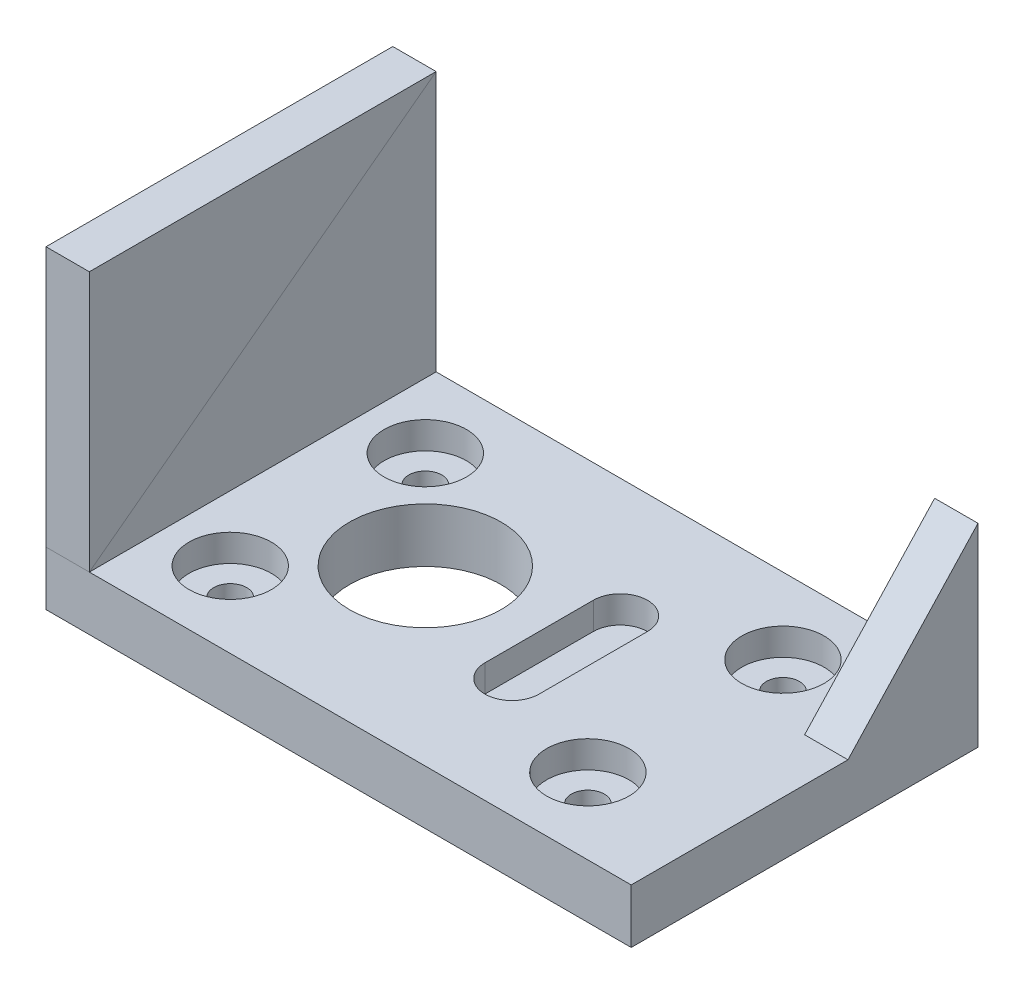
ISO-10303-21;
HEADER;
FILE_DESCRIPTION(('STEP AP214'),'2;1');
FILE_NAME('part.step','',(''),(''),'','','');
FILE_SCHEMA(('AUTOMOTIVE_DESIGN { 1 0 10303 214 1 1 1 1 }'));
ENDSEC;
DATA;
#1=APPLICATION_CONTEXT('core data for automotive mechanical design processes');
#2=APPLICATION_PROTOCOL_DEFINITION('international standard','automotive_design',2000,#1);
#3=PRODUCT_CONTEXT('',#1,'mechanical');
#4=PRODUCT('Part','Part','',(#3));
#5=PRODUCT_RELATED_PRODUCT_CATEGORY('part','',(#4));
#6=PRODUCT_DEFINITION_FORMATION('','',#4);
#7=PRODUCT_DEFINITION_CONTEXT('part definition',#1,'design');
#8=PRODUCT_DEFINITION('design','',#6,#7);
#9=PRODUCT_DEFINITION_SHAPE('','',#8);
#10=(LENGTH_UNIT() NAMED_UNIT(*) SI_UNIT(.MILLI.,.METRE.));
#11=(NAMED_UNIT(*) PLANE_ANGLE_UNIT() SI_UNIT($,.RADIAN.));
#12=(NAMED_UNIT(*) SI_UNIT($,.STERADIAN.) SOLID_ANGLE_UNIT());
#13=UNCERTAINTY_MEASURE_WITH_UNIT(LENGTH_MEASURE(1.E-05),#10,'distance_accuracy_value','');
#14=(GEOMETRIC_REPRESENTATION_CONTEXT(3) GLOBAL_UNCERTAINTY_ASSIGNED_CONTEXT((#13)) GLOBAL_UNIT_ASSIGNED_CONTEXT((#10,
#11,#12)) REPRESENTATION_CONTEXT('',''));
#15=CARTESIAN_POINT('',(0.,0.,0.));
#16=DIRECTION('',(0.,0.,1.));
#17=DIRECTION('',(1.,0.,0.));
#18=AXIS2_PLACEMENT_3D('',#15,#16,#17);
#19=CARTESIAN_POINT('',(-23.,29.,-16.));
#20=DIRECTION('',(0.,-1.,0.));
#21=DIRECTION('',(0.,0.,-1.));
#22=AXIS2_PLACEMENT_3D('',#19,#20,#21);
#23=PLANE('',#22);
#24=DIRECTION('',(0.,0.,1.));
#25=VECTOR('',#24,1.);
#26=CARTESIAN_POINT('',(-27.,29.,-16.));
#27=LINE('',#26,#25);
#28=CARTESIAN_POINT('',(-27.,29.,-16.));
#29=VERTEX_POINT('',#28);
#30=CARTESIAN_POINT('',(-27.,29.,16.));
#31=VERTEX_POINT('',#30);
#32=EDGE_CURVE('E96',#29,#31,#27,.T.);
#33=ORIENTED_EDGE('',*,*,#32,.T.);
#34=DIRECTION('',(-1.,0.,0.));
#35=VECTOR('',#34,1.);
#36=CARTESIAN_POINT('',(-23.,29.,16.));
#37=LINE('',#36,#35);
#38=CARTESIAN_POINT('',(-23.,29.,16.));
#39=VERTEX_POINT('',#38);
#40=EDGE_CURVE('E12',#39,#31,#37,.T.);
#41=ORIENTED_EDGE('',*,*,#40,.F.);
#42=DIRECTION('',(0.,0.,1.));
#43=VECTOR('',#42,1.);
#44=CARTESIAN_POINT('',(-23.,29.,-16.));
#45=LINE('',#44,#43);
#46=CARTESIAN_POINT('',(-23.,29.,-16.));
#47=VERTEX_POINT('',#46);
#48=EDGE_CURVE('E89',#47,#39,#45,.T.);
#49=ORIENTED_EDGE('',*,*,#48,.F.);
#50=DIRECTION('',(-1.,0.,0.));
#51=VECTOR('',#50,1.);
#52=CARTESIAN_POINT('',(-23.,29.,-16.));
#53=LINE('',#52,#51);
#54=EDGE_CURVE('E97',#47,#29,#53,.T.);
#55=ORIENTED_EDGE('',*,*,#54,.T.);
#56=EDGE_LOOP('',(#33,#41,#49,#55));
#57=FACE_BOUND('',#56,.T.);
#58=ADVANCED_FACE('F49',(#57),#23,.F.);
#59=CARTESIAN_POINT('',(-23.,29.,16.));
#60=DIRECTION('',(0.,0.,-1.));
#61=DIRECTION('',(0.,1.,0.));
#62=AXIS2_PLACEMENT_3D('',#59,#60,#61);
#63=PLANE('',#62);
#64=DIRECTION('',(0.,-1.,0.));
#65=VECTOR('',#64,1.);
#66=CARTESIAN_POINT('',(-27.,29.,16.));
#67=LINE('',#66,#65);
#68=CARTESIAN_POINT('',(-27.,5.,16.));
#69=VERTEX_POINT('',#68);
#70=EDGE_CURVE('E77',#31,#69,#67,.T.);
#71=ORIENTED_EDGE('',*,*,#70,.T.);
#72=DIRECTION('',(-1.,0.,0.));
#73=VECTOR('',#72,1.);
#74=CARTESIAN_POINT('',(-23.,5.,16.));
#75=LINE('',#74,#73);
#76=CARTESIAN_POINT('',(-23.,5.,16.));
#77=VERTEX_POINT('',#76);
#78=EDGE_CURVE('E57',#77,#69,#75,.T.);
#79=ORIENTED_EDGE('',*,*,#78,.F.);
#80=DIRECTION('',(0.,-1.,0.));
#81=VECTOR('',#80,1.);
#82=CARTESIAN_POINT('',(-23.,29.,16.));
#83=LINE('',#82,#81);
#84=EDGE_CURVE('E85',#39,#77,#83,.T.);
#85=ORIENTED_EDGE('',*,*,#84,.F.);
#86=ORIENTED_EDGE('',*,*,#40,.T.);
#87=EDGE_LOOP('',(#71,#79,#85,#86));
#88=FACE_BOUND('',#87,.T.);
#89=ADVANCED_FACE('F86',(#88),#63,.F.);
#90=CARTESIAN_POINT('',(-23.,5.,16.));
#91=DIRECTION('',(0.,0.8,0.6));
#92=DIRECTION('',(0.,-0.6,0.8));
#93=AXIS2_PLACEMENT_3D('',#90,#91,#92);
#94=PLANE('',#93);
#95=DIRECTION('',(0.,0.6,-0.8));
#96=VECTOR('',#95,1.);
#97=CARTESIAN_POINT('',(-27.,5.,16.));
#98=LINE('',#97,#96);
#99=EDGE_CURVE('E82',#69,#29,#98,.T.);
#100=ORIENTED_EDGE('',*,*,#99,.T.);
#101=ORIENTED_EDGE('',*,*,#54,.F.);
#102=DIRECTION('',(0.,0.6,-0.8));
#103=VECTOR('',#102,1.);
#104=CARTESIAN_POINT('',(-23.,5.,16.));
#105=LINE('',#104,#103);
#106=EDGE_CURVE('E65',#77,#47,#105,.T.);
#107=ORIENTED_EDGE('',*,*,#106,.F.);
#108=ORIENTED_EDGE('',*,*,#78,.T.);
#109=EDGE_LOOP('',(#100,#101,#107,#108));
#110=FACE_BOUND('',#109,.T.);
#111=ADVANCED_FACE('F104',(#110),#94,.F.);
#112=CARTESIAN_POINT('',(-23.,0.,0.));
#113=DIRECTION('',(1.,0.,0.));
#114=DIRECTION('',(0.,0.,-1.));
#115=AXIS2_PLACEMENT_3D('',#112,#113,#114);
#116=PLANE('',#115);
#117=ORIENTED_EDGE('',*,*,#48,.T.);
#118=ORIENTED_EDGE('',*,*,#84,.T.);
#119=ORIENTED_EDGE('',*,*,#106,.T.);
#120=EDGE_LOOP('',(#117,#118,#119));
#121=FACE_BOUND('',#120,.T.);
#122=ADVANCED_FACE('F92',(#121),#116,.T.);
#123=CARTESIAN_POINT('',(-27.,0.,0.));
#124=DIRECTION('',(1.,0.,0.));
#125=DIRECTION('',(0.,0.,-1.));
#126=AXIS2_PLACEMENT_3D('',#123,#124,#125);
#127=PLANE('',#126);
#128=ORIENTED_EDGE('',*,*,#32,.F.);
#129=ORIENTED_EDGE('',*,*,#99,.F.);
#130=ORIENTED_EDGE('',*,*,#70,.F.);
#131=EDGE_LOOP('',(#128,#129,#130));
#132=FACE_BOUND('',#131,.T.);
#133=ADVANCED_FACE('F105',(#132),#127,.F.);
#134=CLOSED_SHELL('',(#58,#89,#111,#122,#133));
#135=MANIFOLD_SOLID_BREP('B2',#134);
#136=CARTESIAN_POINT('',(-23.,87.8,16.));
#137=DIRECTION('',(1.,0.,0.));
#138=DIRECTION('',(0.,0.,-1.));
#139=AXIS2_PLACEMENT_3D('',#136,#137,#138);
#140=PLANE('',#139);
#141=DIRECTION('',(0.,0.6,-0.8));
#142=VECTOR('',#141,1.);
#143=CARTESIAN_POINT('',(-23.,34.808,-23.744));
#144=LINE('',#143,#142);
#145=CARTESIAN_POINT('',(-23.,5.,16.));
#146=VERTEX_POINT('',#145);
#147=CARTESIAN_POINT('',(-23.,29.,-16.));
#148=VERTEX_POINT('',#147);
#149=EDGE_CURVE('E563',#146,#148,#144,.T.);
#150=ORIENTED_EDGE('',*,*,#149,.F.);
#151=DIRECTION('',(0.,0.,1.));
#152=VECTOR('',#151,1.);
#153=CARTESIAN_POINT('',(-23.,5.,16.));
#154=LINE('',#153,#152);
#155=CARTESIAN_POINT('',(-23.,5.,-16.));
#156=VERTEX_POINT('',#155);
#157=EDGE_CURVE('E156',#156,#146,#154,.T.);
#158=ORIENTED_EDGE('',*,*,#157,.F.);
#159=DIRECTION('',(0.,-1.,0.));
#160=VECTOR('',#159,1.);
#161=CARTESIAN_POINT('',(-23.,87.8,-16.));
#162=LINE('',#161,#160);
#163=EDGE_CURVE('E276',#148,#156,#162,.T.);
#164=ORIENTED_EDGE('',*,*,#163,.F.);
#165=EDGE_LOOP('',(#150,#158,#164));
#166=FACE_BOUND('',#165,.T.);
#167=ADVANCED_FACE('F146',(#166),#140,.T.);
#168=CARTESIAN_POINT('',(-23.,5.,16.));
#169=DIRECTION('',(0.,0.,-1.));
#170=DIRECTION('',(-1.,0.,0.));
#171=AXIS2_PLACEMENT_3D('',#168,#169,#170);
#172=PLANE('',#171);
#173=DIRECTION('',(1.,0.,0.));
#174=VECTOR('',#173,1.);
#175=CARTESIAN_POINT('',(-23.,5.,16.));
#176=LINE('',#175,#174);
#177=CARTESIAN_POINT('',(27.,5.,16.));
#178=VERTEX_POINT('',#177);
#179=EDGE_CURVE('E47',#146,#178,#176,.T.);
#180=ORIENTED_EDGE('',*,*,#179,.F.);
#181=DIRECTION('',(-1.,0.,0.));
#182=VECTOR('',#181,1.);
#183=CARTESIAN_POINT('',(-22.,5.,16.));
#184=LINE('',#183,#182);
#185=CARTESIAN_POINT('',(-27.,5.,16.));
#186=VERTEX_POINT('',#185);
#187=EDGE_CURVE('E557',#146,#186,#184,.T.);
#188=ORIENTED_EDGE('',*,*,#187,.T.);
#189=DIRECTION('',(0.,-1.,0.));
#190=VECTOR('',#189,1.);
#191=CARTESIAN_POINT('',(-27.,87.8,16.));
#192=LINE('',#191,#190);
#193=CARTESIAN_POINT('',(-27.,0.,16.));
#194=VERTEX_POINT('',#193);
#195=EDGE_CURVE('E267',#186,#194,#192,.T.);
#196=ORIENTED_EDGE('',*,*,#195,.T.);
#197=DIRECTION('',(1.,0.,0.));
#198=VECTOR('',#197,1.);
#199=CARTESIAN_POINT('',(-23.,0.,16.));
#200=LINE('',#199,#198);
#201=CARTESIAN_POINT('',(27.,0.,16.));
#202=VERTEX_POINT('',#201);
#203=EDGE_CURVE('E381',#194,#202,#200,.T.);
#204=ORIENTED_EDGE('',*,*,#203,.T.);
#205=DIRECTION('',(0.,-1.,0.));
#206=VECTOR('',#205,1.);
#207=CARTESIAN_POINT('',(27.,87.8,16.));
#208=LINE('',#207,#206);
#209=EDGE_CURVE('E264',#178,#202,#208,.T.);
#210=ORIENTED_EDGE('',*,*,#209,.F.);
#211=EDGE_LOOP('',(#180,#188,#196,#204,#210));
#212=FACE_BOUND('',#211,.T.);
#213=ADVANCED_FACE('F148',(#212),#172,.F.);
#214=CARTESIAN_POINT('',(23.,87.8,16.));
#215=DIRECTION('',(-1.,0.,0.));
#216=DIRECTION('',(0.,0.,1.));
#217=AXIS2_PLACEMENT_3D('',#214,#215,#216);
#218=PLANE('',#217);
#219=DIRECTION('',(0.,-0.732186738163083,0.681103942477288));
#220=VECTOR('',#219,1.);
#221=CARTESIAN_POINT('',(23.,39.4149608582197,-36.0139170774137));
#222=LINE('',#221,#220);
#223=CARTESIAN_POINT('',(23.,17.9,-16.));
#224=VERTEX_POINT('',#223);
#225=CARTESIAN_POINT('',(23.,5.,-3.99999999999999));
#226=VERTEX_POINT('',#225);
#227=EDGE_CURVE('E272',#224,#226,#222,.T.);
#228=ORIENTED_EDGE('',*,*,#227,.F.);
#229=DIRECTION('',(0.,-1.,0.));
#230=VECTOR('',#229,1.);
#231=CARTESIAN_POINT('',(23.,87.8,-16.));
#232=LINE('',#231,#230);
#233=CARTESIAN_POINT('',(23.,5.,-16.));
#234=VERTEX_POINT('',#233);
#235=EDGE_CURVE('E279',#224,#234,#232,.T.);
#236=ORIENTED_EDGE('',*,*,#235,.T.);
#237=DIRECTION('',(0.,0.,-1.));
#238=VECTOR('',#237,1.);
#239=CARTESIAN_POINT('',(23.,5.,16.));
#240=LINE('',#239,#238);
#241=EDGE_CURVE('E382',#226,#234,#240,.T.);
#242=ORIENTED_EDGE('',*,*,#241,.F.);
#243=EDGE_LOOP('',(#228,#236,#242));
#244=FACE_BOUND('',#243,.T.);
#245=ADVANCED_FACE('F453',(#244),#218,.T.);
#246=CARTESIAN_POINT('',(-17.,5.,-9.));
#247=DIRECTION('',(0.,-1.,0.));
#248=DIRECTION('',(0.,0.,-1.));
#249=AXIS2_PLACEMENT_3D('',#246,#247,#248);
#250=CYLINDRICAL_SURFACE('',#249,1.525);
#251=CARTESIAN_POINT('',(-17.,0.,-9.));
#252=DIRECTION('',(0.,1.,0.));
#253=DIRECTION('',(0.,0.,1.));
#254=AXIS2_PLACEMENT_3D('',#251,#252,#253);
#255=CIRCLE('',#254,1.525);
#256=CARTESIAN_POINT('',(-17.,0.,-7.475));
#257=VERTEX_POINT('',#256);
#258=EDGE_CURVE('E377',#257,#257,#255,.T.);
#259=ORIENTED_EDGE('',*,*,#258,.F.);
#260=EDGE_LOOP('',(#259));
#261=FACE_BOUND('',#260,.T.);
#262=CARTESIAN_POINT('',(-17.,2.5,-9.));
#263=DIRECTION('',(0.,1.,0.));
#264=DIRECTION('',(0.,0.,1.));
#265=AXIS2_PLACEMENT_3D('',#262,#263,#264);
#266=CIRCLE('',#265,1.525);
#267=CARTESIAN_POINT('',(-17.,2.5,-7.475));
#268=VERTEX_POINT('',#267);
#269=EDGE_CURVE('E150',#268,#268,#266,.T.);
#270=ORIENTED_EDGE('',*,*,#269,.T.);
#271=EDGE_LOOP('',(#270));
#272=FACE_BOUND('',#271,.T.);
#273=ADVANCED_FACE('F410',(#261,#272),#250,.F.);
#274=CARTESIAN_POINT('',(-17.,5.,9.));
#275=DIRECTION('',(0.,-1.,0.));
#276=DIRECTION('',(0.,0.,-1.));
#277=AXIS2_PLACEMENT_3D('',#274,#275,#276);
#278=CYLINDRICAL_SURFACE('',#277,1.525);
#279=CARTESIAN_POINT('',(-17.,0.,9.));
#280=DIRECTION('',(0.,1.,0.));
#281=DIRECTION('',(0.,0.,1.));
#282=AXIS2_PLACEMENT_3D('',#279,#280,#281);
#283=CIRCLE('',#282,1.525);
#284=CARTESIAN_POINT('',(-17.,0.,10.525));
#285=VERTEX_POINT('',#284);
#286=EDGE_CURVE('E373',#285,#285,#283,.T.);
#287=ORIENTED_EDGE('',*,*,#286,.F.);
#288=EDGE_LOOP('',(#287));
#289=FACE_BOUND('',#288,.T.);
#290=CARTESIAN_POINT('',(-17.,2.5,9.));
#291=DIRECTION('',(0.,1.,0.));
#292=DIRECTION('',(0.,0.,1.));
#293=AXIS2_PLACEMENT_3D('',#290,#291,#292);
#294=CIRCLE('',#293,1.525);
#295=CARTESIAN_POINT('',(-17.,2.5,10.525));
#296=VERTEX_POINT('',#295);
#297=EDGE_CURVE('E401',#296,#296,#294,.T.);
#298=ORIENTED_EDGE('',*,*,#297,.T.);
#299=EDGE_LOOP('',(#298));
#300=FACE_BOUND('',#299,.T.);
#301=ADVANCED_FACE('F505',(#289,#300),#278,.F.);
#302=CARTESIAN_POINT('',(16.,5.,9.));
#303=DIRECTION('',(0.,-1.,0.));
#304=DIRECTION('',(0.,0.,-1.));
#305=AXIS2_PLACEMENT_3D('',#302,#303,#304);
#306=CYLINDRICAL_SURFACE('',#305,1.525);
#307=CARTESIAN_POINT('',(16.,0.,9.));
#308=DIRECTION('',(0.,1.,0.));
#309=DIRECTION('',(0.,0.,1.));
#310=AXIS2_PLACEMENT_3D('',#307,#308,#309);
#311=CIRCLE('',#310,1.525);
#312=CARTESIAN_POINT('',(16.,0.,10.525));
#313=VERTEX_POINT('',#312);
#314=EDGE_CURVE('E369',#313,#313,#311,.T.);
#315=ORIENTED_EDGE('',*,*,#314,.F.);
#316=EDGE_LOOP('',(#315));
#317=FACE_BOUND('',#316,.T.);
#318=CARTESIAN_POINT('',(16.,2.5,9.));
#319=DIRECTION('',(0.,1.,0.));
#320=DIRECTION('',(0.,0.,1.));
#321=AXIS2_PLACEMENT_3D('',#318,#319,#320);
#322=CIRCLE('',#321,1.525);
#323=CARTESIAN_POINT('',(16.,2.5,10.525));
#324=VERTEX_POINT('',#323);
#325=EDGE_CURVE('E398',#324,#324,#322,.T.);
#326=ORIENTED_EDGE('',*,*,#325,.T.);
#327=EDGE_LOOP('',(#326));
#328=FACE_BOUND('',#327,.T.);
#329=ADVANCED_FACE('F501',(#317,#328),#306,.F.);
#330=CARTESIAN_POINT('',(16.,5.,-9.));
#331=DIRECTION('',(0.,-1.,0.));
#332=DIRECTION('',(0.,0.,-1.));
#333=AXIS2_PLACEMENT_3D('',#330,#331,#332);
#334=CYLINDRICAL_SURFACE('',#333,1.525);
#335=CARTESIAN_POINT('',(16.,0.,-9.));
#336=DIRECTION('',(0.,1.,0.));
#337=DIRECTION('',(0.,0.,1.));
#338=AXIS2_PLACEMENT_3D('',#335,#336,#337);
#339=CIRCLE('',#338,1.525);
#340=CARTESIAN_POINT('',(16.,0.,-7.475));
#341=VERTEX_POINT('',#340);
#342=EDGE_CURVE('E361',#341,#341,#339,.T.);
#343=ORIENTED_EDGE('',*,*,#342,.F.);
#344=EDGE_LOOP('',(#343));
#345=FACE_BOUND('',#344,.T.);
#346=CARTESIAN_POINT('',(16.,2.5,-9.));
#347=DIRECTION('',(0.,1.,0.));
#348=DIRECTION('',(0.,0.,1.));
#349=AXIS2_PLACEMENT_3D('',#346,#347,#348);
#350=CIRCLE('',#349,1.525);
#351=CARTESIAN_POINT('',(16.,2.5,-7.475));
#352=VERTEX_POINT('',#351);
#353=EDGE_CURVE('E353',#352,#352,#350,.T.);
#354=ORIENTED_EDGE('',*,*,#353,.T.);
#355=EDGE_LOOP('',(#354));
#356=FACE_BOUND('',#355,.T.);
#357=ADVANCED_FACE('F429',(#345,#356),#334,.F.);
#358=CARTESIAN_POINT('',(0.,5.,0.));
#359=DIRECTION('',(0.,-1.,0.));
#360=DIRECTION('',(0.,0.,-1.));
#361=AXIS2_PLACEMENT_3D('',#358,#359,#360);
#362=PLANE('',#361);
#363=ORIENTED_EDGE('',*,*,#179,.T.);
#364=DIRECTION('',(0.,0.,-1.));
#365=VECTOR('',#364,1.);
#366=CARTESIAN_POINT('',(27.,5.,0.));
#367=LINE('',#366,#365);
#368=CARTESIAN_POINT('',(27.,5.,-3.99999999999999));
#369=VERTEX_POINT('',#368);
#370=EDGE_CURVE('E570',#178,#369,#367,.T.);
#371=ORIENTED_EDGE('',*,*,#370,.T.);
#372=DIRECTION('',(1.,0.,0.));
#373=VECTOR('',#372,1.);
#374=CARTESIAN_POINT('',(22.,5.,-3.99999999999999));
#375=LINE('',#374,#373);
#376=EDGE_CURVE('E577',#226,#369,#375,.T.);
#377=ORIENTED_EDGE('',*,*,#376,.F.);
#378=ORIENTED_EDGE('',*,*,#241,.T.);
#379=DIRECTION('',(-1.,0.,0.));
#380=VECTOR('',#379,1.);
#381=CARTESIAN_POINT('',(-23.,5.,-16.));
#382=LINE('',#381,#380);
#383=EDGE_CURVE('E386',#234,#156,#382,.T.);
#384=ORIENTED_EDGE('',*,*,#383,.T.);
#385=ORIENTED_EDGE('',*,*,#157,.T.);
#386=EDGE_LOOP('',(#363,#371,#377,#378,#384,#385));
#387=FACE_BOUND('',#386,.T.);
#388=CARTESIAN_POINT('',(-17.,5.,9.));
#389=DIRECTION('',(0.,1.,0.));
#390=DIRECTION('',(0.,0.,1.));
#391=AXIS2_PLACEMENT_3D('',#388,#389,#390);
#392=CIRCLE('',#391,3.8);
#393=CARTESIAN_POINT('',(-17.,5.,12.8));
#394=VERTEX_POINT('',#393);
#395=EDGE_CURVE('E338',#394,#394,#392,.T.);
#396=ORIENTED_EDGE('',*,*,#395,.F.);
#397=EDGE_LOOP('',(#396));
#398=FACE_BOUND('',#397,.T.);
#399=CARTESIAN_POINT('',(16.,5.,9.));
#400=DIRECTION('',(0.,1.,0.));
#401=DIRECTION('',(0.,0.,1.));
#402=AXIS2_PLACEMENT_3D('',#399,#400,#401);
#403=CIRCLE('',#402,3.8);
#404=CARTESIAN_POINT('',(16.,5.,12.8));
#405=VERTEX_POINT('',#404);
#406=EDGE_CURVE('E289',#405,#405,#403,.T.);
#407=ORIENTED_EDGE('',*,*,#406,.F.);
#408=EDGE_LOOP('',(#407));
#409=FACE_BOUND('',#408,.T.);
#410=CARTESIAN_POINT('',(16.,5.,-9.));
#411=DIRECTION('',(0.,1.,0.));
#412=DIRECTION('',(0.,0.,1.));
#413=AXIS2_PLACEMENT_3D('',#410,#411,#412);
#414=CIRCLE('',#413,3.8);
#415=CARTESIAN_POINT('',(16.,5.,-5.2));
#416=VERTEX_POINT('',#415);
#417=EDGE_CURVE('E290',#416,#416,#414,.T.);
#418=ORIENTED_EDGE('',*,*,#417,.F.);
#419=EDGE_LOOP('',(#418));
#420=FACE_BOUND('',#419,.T.);
#421=DIRECTION('',(0.,0.,1.));
#422=VECTOR('',#421,1.);
#423=CARTESIAN_POINT('',(2.50000000000001,5.,-5.));
#424=LINE('',#423,#422);
#425=CARTESIAN_POINT('',(2.50000000000001,5.,-5.));
#426=VERTEX_POINT('',#425);
#427=CARTESIAN_POINT('',(2.50000000000001,5.,5.));
#428=VERTEX_POINT('',#427);
#429=EDGE_CURVE('E313',#426,#428,#424,.T.);
#430=ORIENTED_EDGE('',*,*,#429,.F.);
#431=CARTESIAN_POINT('',(5.00000000000001,5.,-5.));
#432=DIRECTION('',(0.,1.,0.));
#433=DIRECTION('',(0.,0.,1.));
#434=AXIS2_PLACEMENT_3D('',#431,#432,#433);
#435=CIRCLE('',#434,2.5);
#436=CARTESIAN_POINT('',(7.50000000000001,5.,-5.));
#437=VERTEX_POINT('',#436);
#438=EDGE_CURVE('E164',#437,#426,#435,.T.);
#439=ORIENTED_EDGE('',*,*,#438,.F.);
#440=DIRECTION('',(0.,0.,-1.));
#441=VECTOR('',#440,1.);
#442=CARTESIAN_POINT('',(7.50000000000001,5.,-5.));
#443=LINE('',#442,#441);
#444=CARTESIAN_POINT('',(7.50000000000001,5.,5.));
#445=VERTEX_POINT('',#444);
#446=EDGE_CURVE('E299',#445,#437,#443,.T.);
#447=ORIENTED_EDGE('',*,*,#446,.F.);
#448=CARTESIAN_POINT('',(5.00000000000001,5.,5.));
#449=DIRECTION('',(0.,1.,0.));
#450=DIRECTION('',(0.,0.,1.));
#451=AXIS2_PLACEMENT_3D('',#448,#449,#450);
#452=CIRCLE('',#451,2.5);
#453=EDGE_CURVE('E317',#428,#445,#452,.T.);
#454=ORIENTED_EDGE('',*,*,#453,.F.);
#455=EDGE_LOOP('',(#430,#439,#447,#454));
#456=FACE_BOUND('',#455,.T.);
#457=CARTESIAN_POINT('',(-17.,5.,-9.));
#458=DIRECTION('',(0.,1.,0.));
#459=DIRECTION('',(0.,0.,1.));
#460=AXIS2_PLACEMENT_3D('',#457,#458,#459);
#461=CIRCLE('',#460,3.8);
#462=CARTESIAN_POINT('',(-17.,5.,-5.2));
#463=VERTEX_POINT('',#462);
#464=EDGE_CURVE('E337',#463,#463,#461,.T.);
#465=ORIENTED_EDGE('',*,*,#464,.F.);
#466=EDGE_LOOP('',(#465));
#467=FACE_BOUND('',#466,.T.);
#468=CARTESIAN_POINT('',(-7.99999999999999,5.,0.));
#469=DIRECTION('',(0.,1.,0.));
#470=DIRECTION('',(0.,0.,1.));
#471=AXIS2_PLACEMENT_3D('',#468,#469,#470);
#472=CIRCLE('',#471,7.);
#473=CARTESIAN_POINT('',(-7.99999999999999,5.,7.));
#474=VERTEX_POINT('',#473);
#475=EDGE_CURVE('E357',#474,#474,#472,.T.);
#476=ORIENTED_EDGE('',*,*,#475,.F.);
#477=EDGE_LOOP('',(#476));
#478=FACE_BOUND('',#477,.T.);
#479=ADVANCED_FACE('F426',(#387,#398,#409,#420,#456,#467,#478),#362,.F.);
#480=CARTESIAN_POINT('',(0.,0.,0.));
#481=DIRECTION('',(0.,-1.,0.));
#482=DIRECTION('',(0.,0.,-1.));
#483=AXIS2_PLACEMENT_3D('',#480,#481,#482);
#484=PLANE('',#483);
#485=DIRECTION('',(1.,0.,0.));
#486=VECTOR('',#485,1.);
#487=CARTESIAN_POINT('',(-39.,0.,-16.));
#488=LINE('',#487,#486);
#489=CARTESIAN_POINT('',(-27.,0.,-16.));
#490=VERTEX_POINT('',#489);
#491=CARTESIAN_POINT('',(27.,0.,-16.));
#492=VERTEX_POINT('',#491);
#493=EDGE_CURVE('E239',#490,#492,#488,.T.);
#494=ORIENTED_EDGE('',*,*,#493,.T.);
#495=DIRECTION('',(0.,0.,1.));
#496=VECTOR('',#495,1.);
#497=CARTESIAN_POINT('',(27.,0.,-18.5));
#498=LINE('',#497,#496);
#499=EDGE_CURVE('E254',#492,#202,#498,.T.);
#500=ORIENTED_EDGE('',*,*,#499,.T.);
#501=ORIENTED_EDGE('',*,*,#203,.F.);
#502=DIRECTION('',(0.,0.,-1.));
#503=VECTOR('',#502,1.);
#504=CARTESIAN_POINT('',(-27.,0.,-18.5));
#505=LINE('',#504,#503);
#506=EDGE_CURVE('E257',#194,#490,#505,.T.);
#507=ORIENTED_EDGE('',*,*,#506,.T.);
#508=EDGE_LOOP('',(#494,#500,#501,#507));
#509=FACE_BOUND('',#508,.T.);
#510=ORIENTED_EDGE('',*,*,#342,.T.);
#511=EDGE_LOOP('',(#510));
#512=FACE_BOUND('',#511,.T.);
#513=ORIENTED_EDGE('',*,*,#286,.T.);
#514=EDGE_LOOP('',(#513));
#515=FACE_BOUND('',#514,.T.);
#516=ORIENTED_EDGE('',*,*,#258,.T.);
#517=EDGE_LOOP('',(#516));
#518=FACE_BOUND('',#517,.T.);
#519=ORIENTED_EDGE('',*,*,#314,.T.);
#520=EDGE_LOOP('',(#519));
#521=FACE_BOUND('',#520,.T.);
#522=CARTESIAN_POINT('',(-7.99999999999999,0.,0.));
#523=DIRECTION('',(0.,1.,0.));
#524=DIRECTION('',(0.,0.,1.));
#525=AXIS2_PLACEMENT_3D('',#522,#523,#524);
#526=CIRCLE('',#525,7.);
#527=CARTESIAN_POINT('',(-7.99999999999999,0.,7.));
#528=VERTEX_POINT('',#527);
#529=EDGE_CURVE('E362',#528,#528,#526,.T.);
#530=ORIENTED_EDGE('',*,*,#529,.T.);
#531=EDGE_LOOP('',(#530));
#532=FACE_BOUND('',#531,.T.);
#533=ADVANCED_FACE('F251',(#509,#512,#515,#518,#521,#532),#484,.T.);
#534=CARTESIAN_POINT('',(-7.99999999999999,5.,0.));
#535=DIRECTION('',(0.,-1.,0.));
#536=DIRECTION('',(0.,0.,-1.));
#537=AXIS2_PLACEMENT_3D('',#534,#535,#536);
#538=CYLINDRICAL_SURFACE('',#537,7.);
#539=ORIENTED_EDGE('',*,*,#475,.T.);
#540=EDGE_LOOP('',(#539));
#541=FACE_BOUND('',#540,.T.);
#542=ORIENTED_EDGE('',*,*,#529,.F.);
#543=EDGE_LOOP('',(#542));
#544=FACE_BOUND('',#543,.T.);
#545=ADVANCED_FACE('F434',(#541,#544),#538,.F.);
#546=CARTESIAN_POINT('',(16.,2.5,-9.));
#547=DIRECTION('',(0.,1.,0.));
#548=DIRECTION('',(0.,0.,1.));
#549=AXIS2_PLACEMENT_3D('',#546,#547,#548);
#550=CYLINDRICAL_SURFACE('',#549,3.8);
#551=CARTESIAN_POINT('',(16.,2.5,-9.));
#552=DIRECTION('',(0.,1.,0.));
#553=DIRECTION('',(0.,0.,1.));
#554=AXIS2_PLACEMENT_3D('',#551,#552,#553);
#555=CIRCLE('',#554,3.8);
#556=CARTESIAN_POINT('',(16.,2.5,-5.2));
#557=VERTEX_POINT('',#556);
#558=EDGE_CURVE('E285',#557,#557,#555,.T.);
#559=ORIENTED_EDGE('',*,*,#558,.F.);
#560=EDGE_LOOP('',(#559));
#561=FACE_BOUND('',#560,.T.);
#562=ORIENTED_EDGE('',*,*,#417,.T.);
#563=EDGE_LOOP('',(#562));
#564=FACE_BOUND('',#563,.T.);
#565=ADVANCED_FACE('F437',(#561,#564),#550,.F.);
#566=CARTESIAN_POINT('',(16.,2.5,-9.));
#567=DIRECTION('',(0.,1.,0.));
#568=DIRECTION('',(0.,0.,1.));
#569=AXIS2_PLACEMENT_3D('',#566,#567,#568);
#570=PLANE('',#569);
#571=ORIENTED_EDGE('',*,*,#353,.F.);
#572=EDGE_LOOP('',(#571));
#573=FACE_BOUND('',#572,.T.);
#574=ORIENTED_EDGE('',*,*,#558,.T.);
#575=EDGE_LOOP('',(#574));
#576=FACE_BOUND('',#575,.T.);
#577=ADVANCED_FACE('F460',(#573,#576),#570,.T.);
#578=CARTESIAN_POINT('',(16.,2.5,9.));
#579=DIRECTION('',(0.,1.,0.));
#580=DIRECTION('',(0.,0.,1.));
#581=AXIS2_PLACEMENT_3D('',#578,#579,#580);
#582=CYLINDRICAL_SURFACE('',#581,3.8);
#583=CARTESIAN_POINT('',(16.,2.5,9.));
#584=DIRECTION('',(0.,1.,0.));
#585=DIRECTION('',(0.,0.,1.));
#586=AXIS2_PLACEMENT_3D('',#583,#584,#585);
#587=CIRCLE('',#586,3.8);
#588=CARTESIAN_POINT('',(16.,2.5,12.8));
#589=VERTEX_POINT('',#588);
#590=EDGE_CURVE('E342',#589,#589,#587,.T.);
#591=ORIENTED_EDGE('',*,*,#590,.F.);
#592=EDGE_LOOP('',(#591));
#593=FACE_BOUND('',#592,.T.);
#594=ORIENTED_EDGE('',*,*,#406,.T.);
#595=EDGE_LOOP('',(#594));
#596=FACE_BOUND('',#595,.T.);
#597=ADVANCED_FACE('F463',(#593,#596),#582,.F.);
#598=CARTESIAN_POINT('',(16.,2.5,9.));
#599=DIRECTION('',(0.,1.,0.));
#600=DIRECTION('',(0.,0.,1.));
#601=AXIS2_PLACEMENT_3D('',#598,#599,#600);
#602=PLANE('',#601);
#603=ORIENTED_EDGE('',*,*,#325,.F.);
#604=EDGE_LOOP('',(#603));
#605=FACE_BOUND('',#604,.T.);
#606=ORIENTED_EDGE('',*,*,#590,.T.);
#607=EDGE_LOOP('',(#606));
#608=FACE_BOUND('',#607,.T.);
#609=ADVANCED_FACE('F491',(#605,#608),#602,.T.);
#610=CARTESIAN_POINT('',(-17.,2.5,9.));
#611=DIRECTION('',(0.,1.,0.));
#612=DIRECTION('',(0.,0.,1.));
#613=AXIS2_PLACEMENT_3D('',#610,#611,#612);
#614=CYLINDRICAL_SURFACE('',#613,3.8);
#615=CARTESIAN_POINT('',(-17.,2.5,9.));
#616=DIRECTION('',(0.,1.,0.));
#617=DIRECTION('',(0.,0.,1.));
#618=AXIS2_PLACEMENT_3D('',#615,#616,#617);
#619=CIRCLE('',#618,3.8);
#620=CARTESIAN_POINT('',(-17.,2.5,12.8));
#621=VERTEX_POINT('',#620);
#622=EDGE_CURVE('E333',#621,#621,#619,.T.);
#623=ORIENTED_EDGE('',*,*,#622,.F.);
#624=EDGE_LOOP('',(#623));
#625=FACE_BOUND('',#624,.T.);
#626=ORIENTED_EDGE('',*,*,#395,.T.);
#627=EDGE_LOOP('',(#626));
#628=FACE_BOUND('',#627,.T.);
#629=ADVANCED_FACE('F487',(#625,#628),#614,.F.);
#630=CARTESIAN_POINT('',(-17.,2.5,9.));
#631=DIRECTION('',(0.,1.,0.));
#632=DIRECTION('',(0.,0.,1.));
#633=AXIS2_PLACEMENT_3D('',#630,#631,#632);
#634=PLANE('',#633);
#635=ORIENTED_EDGE('',*,*,#297,.F.);
#636=EDGE_LOOP('',(#635));
#637=FACE_BOUND('',#636,.T.);
#638=ORIENTED_EDGE('',*,*,#622,.T.);
#639=EDGE_LOOP('',(#638));
#640=FACE_BOUND('',#639,.T.);
#641=ADVANCED_FACE('F422',(#637,#640),#634,.T.);
#642=CARTESIAN_POINT('',(-17.,2.5,-9.));
#643=DIRECTION('',(0.,1.,0.));
#644=DIRECTION('',(0.,0.,1.));
#645=AXIS2_PLACEMENT_3D('',#642,#643,#644);
#646=CYLINDRICAL_SURFACE('',#645,3.8);
#647=CARTESIAN_POINT('',(-17.,2.5,-9.));
#648=DIRECTION('',(0.,1.,0.));
#649=DIRECTION('',(0.,0.,1.));
#650=AXIS2_PLACEMENT_3D('',#647,#648,#649);
#651=CIRCLE('',#650,3.8);
#652=CARTESIAN_POINT('',(-17.,2.5,-5.2));
#653=VERTEX_POINT('',#652);
#654=EDGE_CURVE('E349',#653,#653,#651,.T.);
#655=ORIENTED_EDGE('',*,*,#654,.F.);
#656=EDGE_LOOP('',(#655));
#657=FACE_BOUND('',#656,.T.);
#658=ORIENTED_EDGE('',*,*,#464,.T.);
#659=EDGE_LOOP('',(#658));
#660=FACE_BOUND('',#659,.T.);
#661=ADVANCED_FACE('F416',(#657,#660),#646,.F.);
#662=CARTESIAN_POINT('',(-17.,2.5,-9.));
#663=DIRECTION('',(0.,1.,0.));
#664=DIRECTION('',(0.,0.,1.));
#665=AXIS2_PLACEMENT_3D('',#662,#663,#664);
#666=PLANE('',#665);
#667=ORIENTED_EDGE('',*,*,#269,.F.);
#668=EDGE_LOOP('',(#667));
#669=FACE_BOUND('',#668,.T.);
#670=ORIENTED_EDGE('',*,*,#654,.T.);
#671=EDGE_LOOP('',(#670));
#672=FACE_BOUND('',#671,.T.);
#673=ADVANCED_FACE('F412',(#669,#672),#666,.T.);
#674=CARTESIAN_POINT('',(5.00000000000001,2.5,-5.));
#675=DIRECTION('',(0.,1.,0.));
#676=DIRECTION('',(0.,0.,1.));
#677=AXIS2_PLACEMENT_3D('',#674,#675,#676);
#678=CYLINDRICAL_SURFACE('',#677,2.5);
#679=ORIENTED_EDGE('',*,*,#438,.T.);
#680=DIRECTION('',(0.,1.,0.));
#681=VECTOR('',#680,1.);
#682=CARTESIAN_POINT('',(2.50000000000001,2.5,-5.));
#683=LINE('',#682,#681);
#684=CARTESIAN_POINT('',(2.50000000000001,2.5,-5.));
#685=VERTEX_POINT('',#684);
#686=EDGE_CURVE('E188',#685,#426,#683,.T.);
#687=ORIENTED_EDGE('',*,*,#686,.F.);
#688=CARTESIAN_POINT('',(5.00000000000001,2.5,-5.));
#689=DIRECTION('',(0.,1.,0.));
#690=DIRECTION('',(0.,0.,1.));
#691=AXIS2_PLACEMENT_3D('',#688,#689,#690);
#692=CIRCLE('',#691,2.5);
#693=CARTESIAN_POINT('',(7.50000000000001,2.5,-5.));
#694=VERTEX_POINT('',#693);
#695=EDGE_CURVE('E294',#694,#685,#692,.T.);
#696=ORIENTED_EDGE('',*,*,#695,.F.);
#697=DIRECTION('',(0.,1.,0.));
#698=VECTOR('',#697,1.);
#699=CARTESIAN_POINT('',(7.50000000000001,2.5,-5.));
#700=LINE('',#699,#698);
#701=EDGE_CURVE('E172',#694,#437,#700,.T.);
#702=ORIENTED_EDGE('',*,*,#701,.T.);
#703=EDGE_LOOP('',(#679,#687,#696,#702));
#704=FACE_BOUND('',#703,.T.);
#705=ADVANCED_FACE('F415',(#704),#678,.F.);
#706=CARTESIAN_POINT('',(7.50000000000001,2.5,-5.));
#707=DIRECTION('',(1.,0.,0.));
#708=DIRECTION('',(0.,0.,-1.));
#709=AXIS2_PLACEMENT_3D('',#706,#707,#708);
#710=PLANE('',#709);
#711=ORIENTED_EDGE('',*,*,#446,.T.);
#712=ORIENTED_EDGE('',*,*,#701,.F.);
#713=DIRECTION('',(0.,0.,-1.));
#714=VECTOR('',#713,1.);
#715=CARTESIAN_POINT('',(7.50000000000001,2.5,-5.));
#716=LINE('',#715,#714);
#717=CARTESIAN_POINT('',(7.50000000000001,2.5,5.));
#718=VERTEX_POINT('',#717);
#719=EDGE_CURVE('E307',#718,#694,#716,.T.);
#720=ORIENTED_EDGE('',*,*,#719,.F.);
#721=DIRECTION('',(0.,1.,0.));
#722=VECTOR('',#721,1.);
#723=CARTESIAN_POINT('',(7.50000000000001,2.5,5.));
#724=LINE('',#723,#722);
#725=EDGE_CURVE('E325',#718,#445,#724,.T.);
#726=ORIENTED_EDGE('',*,*,#725,.T.);
#727=EDGE_LOOP('',(#711,#712,#720,#726));
#728=FACE_BOUND('',#727,.T.);
#729=ADVANCED_FACE('F473',(#728),#710,.F.);
#730=CARTESIAN_POINT('',(5.00000000000001,2.5,5.));
#731=DIRECTION('',(0.,1.,0.));
#732=DIRECTION('',(0.,0.,1.));
#733=AXIS2_PLACEMENT_3D('',#730,#731,#732);
#734=CYLINDRICAL_SURFACE('',#733,2.5);
#735=ORIENTED_EDGE('',*,*,#453,.T.);
#736=ORIENTED_EDGE('',*,*,#725,.F.);
#737=CARTESIAN_POINT('',(5.00000000000001,2.5,5.));
#738=DIRECTION('',(0.,1.,0.));
#739=DIRECTION('',(0.,0.,1.));
#740=AXIS2_PLACEMENT_3D('',#737,#738,#739);
#741=CIRCLE('',#740,2.5);
#742=CARTESIAN_POINT('',(2.50000000000001,2.5,5.));
#743=VERTEX_POINT('',#742);
#744=EDGE_CURVE('E303',#743,#718,#741,.T.);
#745=ORIENTED_EDGE('',*,*,#744,.F.);
#746=DIRECTION('',(0.,1.,0.));
#747=VECTOR('',#746,1.);
#748=CARTESIAN_POINT('',(2.50000000000001,2.5,5.));
#749=LINE('',#748,#747);
#750=EDGE_CURVE('E328',#743,#428,#749,.T.);
#751=ORIENTED_EDGE('',*,*,#750,.T.);
#752=EDGE_LOOP('',(#735,#736,#745,#751));
#753=FACE_BOUND('',#752,.T.);
#754=ADVANCED_FACE('F476',(#753),#734,.F.);
#755=CARTESIAN_POINT('',(2.50000000000001,2.5,-5.));
#756=DIRECTION('',(-1.,0.,0.));
#757=DIRECTION('',(0.,0.,1.));
#758=AXIS2_PLACEMENT_3D('',#755,#756,#757);
#759=PLANE('',#758);
#760=ORIENTED_EDGE('',*,*,#429,.T.);
#761=ORIENTED_EDGE('',*,*,#750,.F.);
#762=DIRECTION('',(0.,0.,1.));
#763=VECTOR('',#762,1.);
#764=CARTESIAN_POINT('',(2.50000000000001,2.5,-5.));
#765=LINE('',#764,#763);
#766=EDGE_CURVE('E298',#685,#743,#765,.T.);
#767=ORIENTED_EDGE('',*,*,#766,.F.);
#768=ORIENTED_EDGE('',*,*,#686,.T.);
#769=EDGE_LOOP('',(#760,#761,#767,#768));
#770=FACE_BOUND('',#769,.T.);
#771=ADVANCED_FACE('F471',(#770),#759,.F.);
#772=CARTESIAN_POINT('',(5.00000000000001,2.5,-5.));
#773=DIRECTION('',(0.,1.,0.));
#774=DIRECTION('',(0.,0.,1.));
#775=AXIS2_PLACEMENT_3D('',#772,#773,#774);
#776=PLANE('',#775);
#777=ORIENTED_EDGE('',*,*,#695,.T.);
#778=ORIENTED_EDGE('',*,*,#766,.T.);
#779=ORIENTED_EDGE('',*,*,#744,.T.);
#780=ORIENTED_EDGE('',*,*,#719,.T.);
#781=EDGE_LOOP('',(#777,#778,#779,#780));
#782=FACE_BOUND('',#781,.T.);
#783=ADVANCED_FACE('F468',(#782),#776,.T.);
#784=CARTESIAN_POINT('',(27.,87.8,-18.5));
#785=DIRECTION('',(1.,0.,0.));
#786=DIRECTION('',(0.,0.,-1.));
#787=AXIS2_PLACEMENT_3D('',#784,#785,#786);
#788=PLANE('',#787);
#789=DIRECTION('',(0.,-1.,0.));
#790=VECTOR('',#789,1.);
#791=CARTESIAN_POINT('',(27.,45.9,-16.));
#792=LINE('',#791,#790);
#793=CARTESIAN_POINT('',(27.,17.9,-16.));
#794=VERTEX_POINT('',#793);
#795=EDGE_CURVE('E236',#794,#492,#792,.T.);
#796=ORIENTED_EDGE('',*,*,#795,.F.);
#797=DIRECTION('',(0.,0.732186738163083,-0.681103942477288));
#798=VECTOR('',#797,1.);
#799=CARTESIAN_POINT('',(27.,0.32473180632068,0.349086691794733));
#800=LINE('',#799,#798);
#801=EDGE_CURVE('E574',#369,#794,#800,.T.);
#802=ORIENTED_EDGE('',*,*,#801,.F.);
#803=ORIENTED_EDGE('',*,*,#370,.F.);
#804=ORIENTED_EDGE('',*,*,#209,.T.);
#805=ORIENTED_EDGE('',*,*,#499,.F.);
#806=EDGE_LOOP('',(#796,#802,#803,#804,#805));
#807=FACE_BOUND('',#806,.T.);
#808=ADVANCED_FACE('F261',(#807),#788,.T.);
#809=CARTESIAN_POINT('',(-27.,87.8,-18.5));
#810=DIRECTION('',(-1.,0.,0.));
#811=DIRECTION('',(0.,0.,1.));
#812=AXIS2_PLACEMENT_3D('',#809,#810,#811);
#813=PLANE('',#812);
#814=DIRECTION('',(0.,1.,0.));
#815=VECTOR('',#814,1.);
#816=CARTESIAN_POINT('',(-27.,87.8,-16.));
#817=LINE('',#816,#815);
#818=CARTESIAN_POINT('',(-27.,29.,-16.));
#819=VERTEX_POINT('',#818);
#820=EDGE_CURVE('E259',#490,#819,#817,.T.);
#821=ORIENTED_EDGE('',*,*,#820,.F.);
#822=ORIENTED_EDGE('',*,*,#506,.F.);
#823=ORIENTED_EDGE('',*,*,#195,.F.);
#824=DIRECTION('',(0.,-0.6,0.8));
#825=VECTOR('',#824,1.);
#826=CARTESIAN_POINT('',(-27.,5.,16.));
#827=LINE('',#826,#825);
#828=EDGE_CURVE('E552',#819,#186,#827,.T.);
#829=ORIENTED_EDGE('',*,*,#828,.F.);
#830=EDGE_LOOP('',(#821,#822,#823,#829));
#831=FACE_BOUND('',#830,.T.);
#832=ADVANCED_FACE('F458',(#831),#813,.T.);
#833=CARTESIAN_POINT('',(22.,0.32473180632068,0.349086691794733));
#834=DIRECTION('',(0.,-0.681103942477288,-0.732186738163083));
#835=DIRECTION('',(0.,0.732186738163083,-0.681103942477288));
#836=AXIS2_PLACEMENT_3D('',#833,#834,#835);
#837=PLANE('',#836);
#838=ORIENTED_EDGE('',*,*,#227,.T.);
#839=ORIENTED_EDGE('',*,*,#376,.T.);
#840=ORIENTED_EDGE('',*,*,#801,.T.);
#841=DIRECTION('',(1.,0.,0.));
#842=VECTOR('',#841,1.);
#843=CARTESIAN_POINT('',(22.,17.9,-16.));
#844=LINE('',#843,#842);
#845=EDGE_CURVE('E242',#224,#794,#844,.T.);
#846=ORIENTED_EDGE('',*,*,#845,.F.);
#847=EDGE_LOOP('',(#838,#839,#840,#846));
#848=FACE_BOUND('',#847,.T.);
#849=ADVANCED_FACE('F539',(#848),#837,.F.);
#850=CARTESIAN_POINT('',(-22.,5.,16.));
#851=DIRECTION('',(0.,-0.8,-0.6));
#852=DIRECTION('',(0.,0.6,-0.8));
#853=AXIS2_PLACEMENT_3D('',#850,#851,#852);
#854=PLANE('',#853);
#855=ORIENTED_EDGE('',*,*,#149,.T.);
#856=DIRECTION('',(-1.,0.,0.));
#857=VECTOR('',#856,1.);
#858=CARTESIAN_POINT('',(-22.,29.,-16.));
#859=LINE('',#858,#857);
#860=EDGE_CURVE('E560',#148,#819,#859,.T.);
#861=ORIENTED_EDGE('',*,*,#860,.T.);
#862=ORIENTED_EDGE('',*,*,#828,.T.);
#863=ORIENTED_EDGE('',*,*,#187,.F.);
#864=EDGE_LOOP('',(#855,#861,#862,#863));
#865=FACE_BOUND('',#864,.T.);
#866=ADVANCED_FACE('F548',(#865),#854,.F.);
#867=CARTESIAN_POINT('',(-39.,45.9,-16.));
#868=DIRECTION('',(0.,0.,1.));
#869=DIRECTION('',(1.,0.,0.));
#870=AXIS2_PLACEMENT_3D('',#867,#868,#869);
#871=PLANE('',#870);
#872=ORIENTED_EDGE('',*,*,#820,.T.);
#873=ORIENTED_EDGE('',*,*,#860,.F.);
#874=ORIENTED_EDGE('',*,*,#163,.T.);
#875=ORIENTED_EDGE('',*,*,#383,.F.);
#876=ORIENTED_EDGE('',*,*,#235,.F.);
#877=ORIENTED_EDGE('',*,*,#845,.T.);
#878=ORIENTED_EDGE('',*,*,#795,.T.);
#879=ORIENTED_EDGE('',*,*,#493,.F.);
#880=EDGE_LOOP('',(#872,#873,#874,#875,#876,#877,#878,#879));
#881=FACE_BOUND('',#880,.T.);
#882=ADVANCED_FACE('F238',(#881),#871,.F.);
#883=CLOSED_SHELL('',(#167,#213,#245,#273,#301,#329,#357,#479,#533,#545,#565,#577,#597,#609,
#629,#641,#661,#673,#705,#729,#754,#771,#783,#808,#832,#849,#866,#882));
#884=MANIFOLD_SOLID_BREP('B6',#883);
#885=ADVANCED_BREP_SHAPE_REPRESENTATION('',(#18,#135,#884),#14);
#886=SHAPE_DEFINITION_REPRESENTATION(#9,#885);
ENDSEC;
END-ISO-10303-21;
